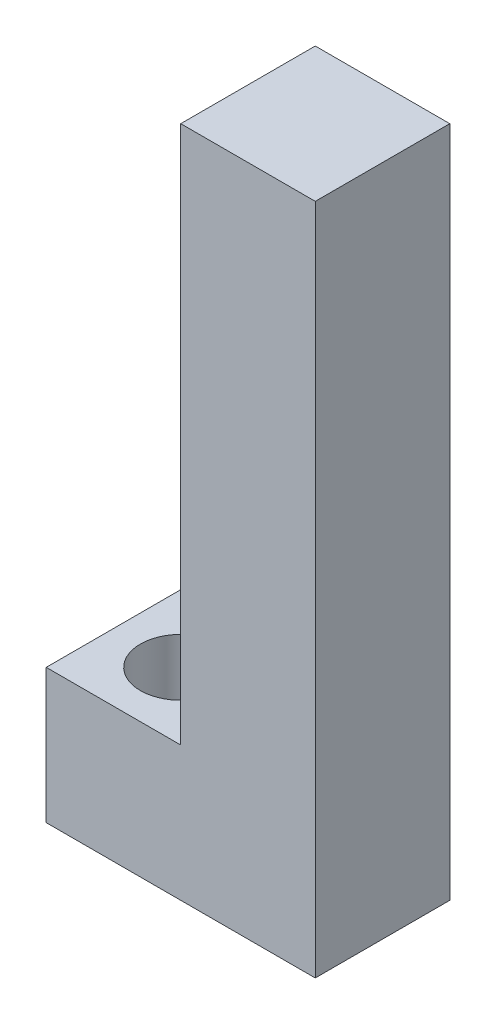
ISO-10303-21;
HEADER;
FILE_DESCRIPTION(('STEP AP214'),'2;1');
FILE_NAME('part.step','',(''),(''),'','','');
FILE_SCHEMA(('AUTOMOTIVE_DESIGN { 1 0 10303 214 1 1 1 1 }'));
ENDSEC;
DATA;
#1=APPLICATION_CONTEXT('core data for automotive mechanical design processes');
#2=APPLICATION_PROTOCOL_DEFINITION('international standard','automotive_design',2000,#1);
#3=PRODUCT_CONTEXT('',#1,'mechanical');
#4=PRODUCT('Part','Part','',(#3));
#5=PRODUCT_RELATED_PRODUCT_CATEGORY('part','',(#4));
#6=PRODUCT_DEFINITION_FORMATION('','',#4);
#7=PRODUCT_DEFINITION_CONTEXT('part definition',#1,'design');
#8=PRODUCT_DEFINITION('design','',#6,#7);
#9=PRODUCT_DEFINITION_SHAPE('','',#8);
#10=(LENGTH_UNIT() NAMED_UNIT(*) SI_UNIT(.MILLI.,.METRE.));
#11=(NAMED_UNIT(*) PLANE_ANGLE_UNIT() SI_UNIT($,.RADIAN.));
#12=(NAMED_UNIT(*) SI_UNIT($,.STERADIAN.) SOLID_ANGLE_UNIT());
#13=UNCERTAINTY_MEASURE_WITH_UNIT(LENGTH_MEASURE(1.E-05),#10,'distance_accuracy_value','');
#14=(GEOMETRIC_REPRESENTATION_CONTEXT(3) GLOBAL_UNCERTAINTY_ASSIGNED_CONTEXT((#13)) GLOBAL_UNIT_ASSIGNED_CONTEXT((#10,
#11,#12)) REPRESENTATION_CONTEXT('',''));
#15=CARTESIAN_POINT('',(0.,0.,0.));
#16=DIRECTION('',(0.,0.,1.));
#17=DIRECTION('',(1.,0.,0.));
#18=AXIS2_PLACEMENT_3D('',#15,#16,#17);
#19=CARTESIAN_POINT('',(0.,-5.,5.));
#20=DIRECTION('',(1.,0.,0.));
#21=DIRECTION('',(0.,0.,-1.));
#22=AXIS2_PLACEMENT_3D('',#19,#20,#21);
#23=PLANE('',#22);
#24=DIRECTION('',(0.,-1.,0.));
#25=VECTOR('',#24,1.);
#26=CARTESIAN_POINT('',(0.,-5.,0.));
#27=LINE('',#26,#25);
#28=CARTESIAN_POINT('',(0.,0.,0.));
#29=VERTEX_POINT('',#28);
#30=CARTESIAN_POINT('',(0.,-5.,0.));
#31=VERTEX_POINT('',#30);
#32=EDGE_CURVE('E123',#29,#31,#27,.T.);
#33=ORIENTED_EDGE('',*,*,#32,.T.);
#34=DIRECTION('',(0.,0.,-1.));
#35=VECTOR('',#34,1.);
#36=CARTESIAN_POINT('',(0.,-5.,5.));
#37=LINE('',#36,#35);
#38=CARTESIAN_POINT('',(0.,-5.,5.));
#39=VERTEX_POINT('',#38);
#40=EDGE_CURVE('E11',#39,#31,#37,.T.);
#41=ORIENTED_EDGE('',*,*,#40,.F.);
#42=DIRECTION('',(0.,-1.,0.));
#43=VECTOR('',#42,1.);
#44=CARTESIAN_POINT('',(0.,-5.,5.));
#45=LINE('',#44,#43);
#46=CARTESIAN_POINT('',(0.,0.,5.));
#47=VERTEX_POINT('',#46);
#48=EDGE_CURVE('E134',#47,#39,#45,.T.);
#49=ORIENTED_EDGE('',*,*,#48,.F.);
#50=DIRECTION('',(0.,0.,-1.));
#51=VECTOR('',#50,1.);
#52=CARTESIAN_POINT('',(0.,0.,5.));
#53=LINE('',#52,#51);
#54=EDGE_CURVE('E119',#47,#29,#53,.T.);
#55=ORIENTED_EDGE('',*,*,#54,.T.);
#56=EDGE_LOOP('',(#33,#41,#49,#55));
#57=FACE_BOUND('',#56,.T.);
#58=ADVANCED_FACE('F39',(#57),#23,.F.);
#59=CARTESIAN_POINT('',(10.,-5.,5.));
#60=DIRECTION('',(0.,1.,0.));
#61=DIRECTION('',(-1.,0.,0.));
#62=AXIS2_PLACEMENT_3D('',#59,#60,#61);
#63=PLANE('',#62);
#64=CARTESIAN_POINT('',(2.5,-5.,2.5));
#65=DIRECTION('',(0.,1.,0.));
#66=DIRECTION('',(0.,0.,1.));
#67=AXIS2_PLACEMENT_3D('',#64,#65,#66);
#68=CIRCLE('',#67,1.5);
#69=CARTESIAN_POINT('',(2.5,-5.,4.));
#70=VERTEX_POINT('',#69);
#71=EDGE_CURVE('E127',#70,#70,#68,.T.);
#72=ORIENTED_EDGE('',*,*,#71,.T.);
#73=EDGE_LOOP('',(#72));
#74=FACE_BOUND('',#73,.T.);
#75=DIRECTION('',(1.,0.,0.));
#76=VECTOR('',#75,1.);
#77=CARTESIAN_POINT('',(10.,-5.,0.));
#78=LINE('',#77,#76);
#79=CARTESIAN_POINT('',(10.,-5.,0.));
#80=VERTEX_POINT('',#79);
#81=EDGE_CURVE('E126',#31,#80,#78,.T.);
#82=ORIENTED_EDGE('',*,*,#81,.T.);
#83=DIRECTION('',(0.,0.,-1.));
#84=VECTOR('',#83,1.);
#85=CARTESIAN_POINT('',(10.,-5.,5.));
#86=LINE('',#85,#84);
#87=CARTESIAN_POINT('',(10.,-5.,5.));
#88=VERTEX_POINT('',#87);
#89=EDGE_CURVE('E47',#88,#80,#86,.T.);
#90=ORIENTED_EDGE('',*,*,#89,.F.);
#91=DIRECTION('',(1.,0.,0.));
#92=VECTOR('',#91,1.);
#93=CARTESIAN_POINT('',(10.,-5.,5.));
#94=LINE('',#93,#92);
#95=EDGE_CURVE('E92',#39,#88,#94,.T.);
#96=ORIENTED_EDGE('',*,*,#95,.F.);
#97=ORIENTED_EDGE('',*,*,#40,.T.);
#98=EDGE_LOOP('',(#82,#90,#96,#97));
#99=FACE_BOUND('',#98,.T.);
#100=ADVANCED_FACE('F162',(#74,#99),#63,.F.);
#101=CARTESIAN_POINT('',(10.,20.,5.));
#102=DIRECTION('',(-1.,0.,0.));
#103=DIRECTION('',(0.,-1.,0.));
#104=AXIS2_PLACEMENT_3D('',#101,#102,#103);
#105=PLANE('',#104);
#106=DIRECTION('',(0.,1.,0.));
#107=VECTOR('',#106,1.);
#108=CARTESIAN_POINT('',(10.,20.,0.));
#109=LINE('',#108,#107);
#110=CARTESIAN_POINT('',(10.,20.,0.));
#111=VERTEX_POINT('',#110);
#112=EDGE_CURVE('E129',#80,#111,#109,.T.);
#113=ORIENTED_EDGE('',*,*,#112,.T.);
#114=DIRECTION('',(0.,0.,-1.));
#115=VECTOR('',#114,1.);
#116=CARTESIAN_POINT('',(10.,20.,5.));
#117=LINE('',#116,#115);
#118=CARTESIAN_POINT('',(10.,20.,5.));
#119=VERTEX_POINT('',#118);
#120=EDGE_CURVE('E114',#119,#111,#117,.T.);
#121=ORIENTED_EDGE('',*,*,#120,.F.);
#122=DIRECTION('',(0.,1.,0.));
#123=VECTOR('',#122,1.);
#124=CARTESIAN_POINT('',(10.,20.,5.));
#125=LINE('',#124,#123);
#126=EDGE_CURVE('E105',#88,#119,#125,.T.);
#127=ORIENTED_EDGE('',*,*,#126,.F.);
#128=ORIENTED_EDGE('',*,*,#89,.T.);
#129=EDGE_LOOP('',(#113,#121,#127,#128));
#130=FACE_BOUND('',#129,.T.);
#131=ADVANCED_FACE('F140',(#130),#105,.F.);
#132=CARTESIAN_POINT('',(5.,20.,5.));
#133=DIRECTION('',(0.,-1.,0.));
#134=DIRECTION('',(0.,0.,-1.));
#135=AXIS2_PLACEMENT_3D('',#132,#133,#134);
#136=PLANE('',#135);
#137=DIRECTION('',(-1.,0.,0.));
#138=VECTOR('',#137,1.);
#139=CARTESIAN_POINT('',(5.,20.,0.));
#140=LINE('',#139,#138);
#141=CARTESIAN_POINT('',(5.,20.,0.));
#142=VERTEX_POINT('',#141);
#143=EDGE_CURVE('E113',#111,#142,#140,.T.);
#144=ORIENTED_EDGE('',*,*,#143,.T.);
#145=DIRECTION('',(0.,0.,-1.));
#146=VECTOR('',#145,1.);
#147=CARTESIAN_POINT('',(5.,20.,5.));
#148=LINE('',#147,#146);
#149=CARTESIAN_POINT('',(5.,20.,5.));
#150=VERTEX_POINT('',#149);
#151=EDGE_CURVE('E110',#150,#142,#148,.T.);
#152=ORIENTED_EDGE('',*,*,#151,.F.);
#153=DIRECTION('',(-1.,0.,0.));
#154=VECTOR('',#153,1.);
#155=CARTESIAN_POINT('',(5.,20.,5.));
#156=LINE('',#155,#154);
#157=EDGE_CURVE('E99',#119,#150,#156,.T.);
#158=ORIENTED_EDGE('',*,*,#157,.F.);
#159=ORIENTED_EDGE('',*,*,#120,.T.);
#160=EDGE_LOOP('',(#144,#152,#158,#159));
#161=FACE_BOUND('',#160,.T.);
#162=ADVANCED_FACE('F111',(#161),#136,.F.);
#163=CARTESIAN_POINT('',(5.,0.,5.));
#164=DIRECTION('',(1.,0.,0.));
#165=DIRECTION('',(0.,0.,-1.));
#166=AXIS2_PLACEMENT_3D('',#163,#164,#165);
#167=PLANE('',#166);
#168=DIRECTION('',(0.,-1.,0.));
#169=VECTOR('',#168,1.);
#170=CARTESIAN_POINT('',(5.,0.,0.));
#171=LINE('',#170,#169);
#172=CARTESIAN_POINT('',(5.,0.,0.));
#173=VERTEX_POINT('',#172);
#174=EDGE_CURVE('E78',#142,#173,#171,.T.);
#175=ORIENTED_EDGE('',*,*,#174,.T.);
#176=DIRECTION('',(0.,0.,-1.));
#177=VECTOR('',#176,1.);
#178=CARTESIAN_POINT('',(5.,0.,5.));
#179=LINE('',#178,#177);
#180=CARTESIAN_POINT('',(5.,0.,5.));
#181=VERTEX_POINT('',#180);
#182=EDGE_CURVE('E115',#181,#173,#179,.T.);
#183=ORIENTED_EDGE('',*,*,#182,.F.);
#184=DIRECTION('',(0.,-1.,0.));
#185=VECTOR('',#184,1.);
#186=CARTESIAN_POINT('',(5.,0.,5.));
#187=LINE('',#186,#185);
#188=EDGE_CURVE('E103',#150,#181,#187,.T.);
#189=ORIENTED_EDGE('',*,*,#188,.F.);
#190=ORIENTED_EDGE('',*,*,#151,.T.);
#191=EDGE_LOOP('',(#175,#183,#189,#190));
#192=FACE_BOUND('',#191,.T.);
#193=ADVANCED_FACE('F117',(#192),#167,.F.);
#194=CARTESIAN_POINT('',(0.,0.,5.));
#195=DIRECTION('',(0.,-1.,0.));
#196=DIRECTION('',(0.,0.,-1.));
#197=AXIS2_PLACEMENT_3D('',#194,#195,#196);
#198=PLANE('',#197);
#199=CARTESIAN_POINT('',(2.5,0.,2.5));
#200=DIRECTION('',(0.,1.,0.));
#201=DIRECTION('',(0.,0.,1.));
#202=AXIS2_PLACEMENT_3D('',#199,#200,#201);
#203=CIRCLE('',#202,1.5);
#204=CARTESIAN_POINT('',(2.5,0.,4.));
#205=VERTEX_POINT('',#204);
#206=EDGE_CURVE('E209',#205,#205,#203,.T.);
#207=ORIENTED_EDGE('',*,*,#206,.F.);
#208=EDGE_LOOP('',(#207));
#209=FACE_BOUND('',#208,.T.);
#210=DIRECTION('',(-1.,0.,0.));
#211=VECTOR('',#210,1.);
#212=CARTESIAN_POINT('',(0.,0.,0.));
#213=LINE('',#212,#211);
#214=EDGE_CURVE('E84',#173,#29,#213,.T.);
#215=ORIENTED_EDGE('',*,*,#214,.T.);
#216=ORIENTED_EDGE('',*,*,#54,.F.);
#217=DIRECTION('',(-1.,0.,0.));
#218=VECTOR('',#217,1.);
#219=CARTESIAN_POINT('',(0.,0.,5.));
#220=LINE('',#219,#218);
#221=EDGE_CURVE('E55',#181,#47,#220,.T.);
#222=ORIENTED_EDGE('',*,*,#221,.F.);
#223=ORIENTED_EDGE('',*,*,#182,.T.);
#224=EDGE_LOOP('',(#215,#216,#222,#223));
#225=FACE_BOUND('',#224,.T.);
#226=ADVANCED_FACE('F147',(#209,#225),#198,.F.);
#227=CARTESIAN_POINT('',(0.,0.,5.));
#228=DIRECTION('',(0.,0.,-1.));
#229=DIRECTION('',(-1.,0.,0.));
#230=AXIS2_PLACEMENT_3D('',#227,#228,#229);
#231=PLANE('',#230);
#232=ORIENTED_EDGE('',*,*,#48,.T.);
#233=ORIENTED_EDGE('',*,*,#95,.T.);
#234=ORIENTED_EDGE('',*,*,#126,.T.);
#235=ORIENTED_EDGE('',*,*,#157,.T.);
#236=ORIENTED_EDGE('',*,*,#188,.T.);
#237=ORIENTED_EDGE('',*,*,#221,.T.);
#238=EDGE_LOOP('',(#232,#233,#234,#235,#236,#237));
#239=FACE_BOUND('',#238,.T.);
#240=ADVANCED_FACE('F101',(#239),#231,.F.);
#241=CARTESIAN_POINT('',(0.,0.,0.));
#242=DIRECTION('',(0.,0.,-1.));
#243=DIRECTION('',(-1.,0.,0.));
#244=AXIS2_PLACEMENT_3D('',#241,#242,#243);
#245=PLANE('',#244);
#246=ORIENTED_EDGE('',*,*,#32,.F.);
#247=ORIENTED_EDGE('',*,*,#214,.F.);
#248=ORIENTED_EDGE('',*,*,#174,.F.);
#249=ORIENTED_EDGE('',*,*,#143,.F.);
#250=ORIENTED_EDGE('',*,*,#112,.F.);
#251=ORIENTED_EDGE('',*,*,#81,.F.);
#252=EDGE_LOOP('',(#246,#247,#248,#249,#250,#251));
#253=FACE_BOUND('',#252,.T.);
#254=ADVANCED_FACE('F143',(#253),#245,.T.);
#255=CARTESIAN_POINT('',(2.5,-5.,2.5));
#256=DIRECTION('',(0.,1.,0.));
#257=DIRECTION('',(0.,0.,1.));
#258=AXIS2_PLACEMENT_3D('',#255,#256,#257);
#259=CYLINDRICAL_SURFACE('',#258,1.5);
#260=ORIENTED_EDGE('',*,*,#71,.F.);
#261=EDGE_LOOP('',(#260));
#262=FACE_BOUND('',#261,.T.);
#263=ORIENTED_EDGE('',*,*,#206,.T.);
#264=EDGE_LOOP('',(#263));
#265=FACE_BOUND('',#264,.T.);
#266=ADVANCED_FACE('F193',(#262,#265),#259,.F.);
#267=CLOSED_SHELL('',(#58,#100,#131,#162,#193,#226,#240,#254,#266));
#268=MANIFOLD_SOLID_BREP('B2',#267);
#269=ADVANCED_BREP_SHAPE_REPRESENTATION('',(#18,#268),#14);
#270=SHAPE_DEFINITION_REPRESENTATION(#9,#269);
ENDSEC;
END-ISO-10303-21;
